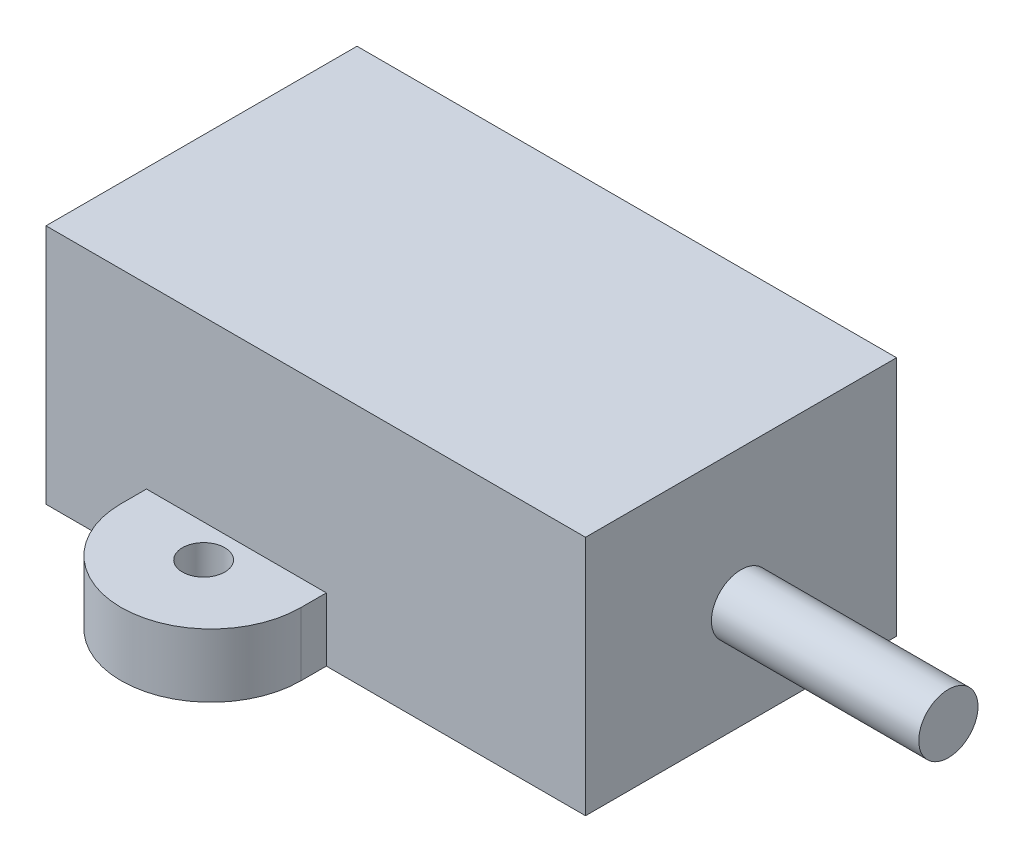
ISO-10303-21;
HEADER;
FILE_DESCRIPTION(('STEP AP214'),'2;1');
FILE_NAME('part.step','',(''),(''),'','','');
FILE_SCHEMA(('AUTOMOTIVE_DESIGN { 1 0 10303 214 1 1 1 1 }'));
ENDSEC;
DATA;
#1=APPLICATION_CONTEXT('core data for automotive mechanical design processes');
#2=APPLICATION_PROTOCOL_DEFINITION('international standard','automotive_design',2000,#1);
#3=PRODUCT_CONTEXT('',#1,'mechanical');
#4=PRODUCT('Part','Part','',(#3));
#5=PRODUCT_RELATED_PRODUCT_CATEGORY('part','',(#4));
#6=PRODUCT_DEFINITION_FORMATION('','',#4);
#7=PRODUCT_DEFINITION_CONTEXT('part definition',#1,'design');
#8=PRODUCT_DEFINITION('design','',#6,#7);
#9=PRODUCT_DEFINITION_SHAPE('','',#8);
#10=(LENGTH_UNIT() NAMED_UNIT(*) SI_UNIT(.MILLI.,.METRE.));
#11=(NAMED_UNIT(*) PLANE_ANGLE_UNIT() SI_UNIT($,.RADIAN.));
#12=(NAMED_UNIT(*) SI_UNIT($,.STERADIAN.) SOLID_ANGLE_UNIT());
#13=UNCERTAINTY_MEASURE_WITH_UNIT(LENGTH_MEASURE(1.E-05),#10,'distance_accuracy_value','');
#14=(GEOMETRIC_REPRESENTATION_CONTEXT(3) GLOBAL_UNCERTAINTY_ASSIGNED_CONTEXT((#13)) GLOBAL_UNIT_ASSIGNED_CONTEXT((#10,
#11,#12)) REPRESENTATION_CONTEXT('',''));
#15=CARTESIAN_POINT('',(0.,0.,0.));
#16=DIRECTION('',(0.,0.,1.));
#17=DIRECTION('',(1.,0.,0.));
#18=AXIS2_PLACEMENT_3D('',#15,#16,#17);
#19=CARTESIAN_POINT('',(-3.75,0.,8.55));
#20=DIRECTION('',(0.,-1.,0.));
#21=DIRECTION('',(0.,0.,-1.));
#22=AXIS2_PLACEMENT_3D('',#19,#20,#21);
#23=CYLINDRICAL_SURFACE('',#22,4.25);
#24=DIRECTION('',(0.,-1.,0.));
#25=VECTOR('',#24,1.);
#26=CARTESIAN_POINT('',(-8.,3.,8.55));
#27=LINE('',#26,#25);
#28=CARTESIAN_POINT('',(-8.,0.,8.55));
#29=VERTEX_POINT('',#28);
#30=CARTESIAN_POINT('',(-8.,3.,8.55));
#31=VERTEX_POINT('',#30);
#32=EDGE_CURVE('E136',#29,#31,#27,.F.);
#33=ORIENTED_EDGE('',*,*,#32,.F.);
#34=CARTESIAN_POINT('',(-3.75,0.,8.55));
#35=DIRECTION('',(0.,1.,0.));
#36=DIRECTION('',(0.,0.,1.));
#37=AXIS2_PLACEMENT_3D('',#34,#35,#36);
#38=CIRCLE('',#37,4.25);
#39=CARTESIAN_POINT('',(0.500000000000002,0.,8.55));
#40=VERTEX_POINT('',#39);
#41=EDGE_CURVE('E42',#40,#29,#38,.F.);
#42=ORIENTED_EDGE('',*,*,#41,.F.);
#43=DIRECTION('',(0.,-1.,0.));
#44=VECTOR('',#43,1.);
#45=CARTESIAN_POINT('',(0.500000000000002,3.,8.55));
#46=LINE('',#45,#44);
#47=CARTESIAN_POINT('',(0.500000000000002,3.,8.55));
#48=VERTEX_POINT('',#47);
#49=EDGE_CURVE('E223',#48,#40,#46,.T.);
#50=ORIENTED_EDGE('',*,*,#49,.F.);
#51=CARTESIAN_POINT('',(-3.75,3.,8.55));
#52=DIRECTION('',(0.,1.,0.));
#53=DIRECTION('',(0.,0.,1.));
#54=AXIS2_PLACEMENT_3D('',#51,#52,#53);
#55=CIRCLE('',#54,4.25);
#56=EDGE_CURVE('E11',#31,#48,#55,.T.);
#57=ORIENTED_EDGE('',*,*,#56,.F.);
#58=EDGE_LOOP('',(#33,#42,#50,#57));
#59=FACE_BOUND('',#58,.T.);
#60=ADVANCED_FACE('F34',(#59),#23,.T.);
#61=CARTESIAN_POINT('',(-12.75,11.4,7.35));
#62=DIRECTION('',(0.,0.,-1.));
#63=DIRECTION('',(-1.,0.,0.));
#64=AXIS2_PLACEMENT_3D('',#61,#62,#63);
#65=PLANE('',#64);
#66=DIRECTION('',(0.,-1.,0.));
#67=VECTOR('',#66,1.);
#68=CARTESIAN_POINT('',(-8.,3.,7.35));
#69=LINE('',#68,#67);
#70=CARTESIAN_POINT('',(-8.,3.,7.35));
#71=VERTEX_POINT('',#70);
#72=CARTESIAN_POINT('',(-8.,0.,7.35));
#73=VERTEX_POINT('',#72);
#74=EDGE_CURVE('E134',#71,#73,#69,.T.);
#75=ORIENTED_EDGE('',*,*,#74,.F.);
#76=DIRECTION('',(-1.,0.,0.));
#77=VECTOR('',#76,1.);
#78=CARTESIAN_POINT('',(-8.,3.,7.35));
#79=LINE('',#78,#77);
#80=CARTESIAN_POINT('',(0.500000000000002,3.,7.35));
#81=VERTEX_POINT('',#80);
#82=EDGE_CURVE('E118',#81,#71,#79,.T.);
#83=ORIENTED_EDGE('',*,*,#82,.F.);
#84=DIRECTION('',(0.,-1.,0.));
#85=VECTOR('',#84,1.);
#86=CARTESIAN_POINT('',(0.500000000000002,3.,7.35));
#87=LINE('',#86,#85);
#88=CARTESIAN_POINT('',(0.500000000000002,0.,7.35));
#89=VERTEX_POINT('',#88);
#90=EDGE_CURVE('E144',#81,#89,#87,.T.);
#91=ORIENTED_EDGE('',*,*,#90,.T.);
#92=DIRECTION('',(1.,0.,0.));
#93=VECTOR('',#92,1.);
#94=CARTESIAN_POINT('',(-12.75,0.,7.35));
#95=LINE('',#94,#93);
#96=CARTESIAN_POINT('',(12.75,0.,7.35));
#97=VERTEX_POINT('',#96);
#98=EDGE_CURVE('E197',#89,#97,#95,.T.);
#99=ORIENTED_EDGE('',*,*,#98,.T.);
#100=DIRECTION('',(0.,-1.,0.));
#101=VECTOR('',#100,1.);
#102=CARTESIAN_POINT('',(12.75,11.4,7.35));
#103=LINE('',#102,#101);
#104=CARTESIAN_POINT('',(12.75,11.4,7.35));
#105=VERTEX_POINT('',#104);
#106=EDGE_CURVE('E188',#105,#97,#103,.T.);
#107=ORIENTED_EDGE('',*,*,#106,.F.);
#108=DIRECTION('',(1.,0.,0.));
#109=VECTOR('',#108,1.);
#110=CARTESIAN_POINT('',(-12.75,11.4,7.35));
#111=LINE('',#110,#109);
#112=CARTESIAN_POINT('',(-12.75,11.4,7.35));
#113=VERTEX_POINT('',#112);
#114=EDGE_CURVE('E186',#113,#105,#111,.T.);
#115=ORIENTED_EDGE('',*,*,#114,.F.);
#116=DIRECTION('',(0.,-1.,0.));
#117=VECTOR('',#116,1.);
#118=CARTESIAN_POINT('',(-12.75,11.4,7.35));
#119=LINE('',#118,#117);
#120=CARTESIAN_POINT('',(-12.75,0.,7.35));
#121=VERTEX_POINT('',#120);
#122=EDGE_CURVE('E201',#113,#121,#119,.T.);
#123=ORIENTED_EDGE('',*,*,#122,.T.);
#124=EDGE_CURVE('E143',#121,#73,#95,.T.);
#125=ORIENTED_EDGE('',*,*,#124,.T.);
#126=EDGE_LOOP('',(#75,#83,#91,#99,#107,#115,#123,#125));
#127=FACE_BOUND('',#126,.T.);
#128=ADVANCED_FACE('F140',(#127),#65,.F.);
#129=CARTESIAN_POINT('',(-3.75,3.,-8.55));
#130=DIRECTION('',(0.,-1.,0.));
#131=DIRECTION('',(0.,0.,-1.));
#132=AXIS2_PLACEMENT_3D('',#129,#130,#131);
#133=CYLINDRICAL_SURFACE('',#132,4.25);
#134=DIRECTION('',(0.,-1.,0.));
#135=VECTOR('',#134,1.);
#136=CARTESIAN_POINT('',(-8.,3.,-8.55));
#137=LINE('',#136,#135);
#138=CARTESIAN_POINT('',(-8.,3.,-8.55));
#139=VERTEX_POINT('',#138);
#140=CARTESIAN_POINT('',(-8.,0.,-8.55));
#141=VERTEX_POINT('',#140);
#142=EDGE_CURVE('E212',#139,#141,#137,.T.);
#143=ORIENTED_EDGE('',*,*,#142,.F.);
#144=CARTESIAN_POINT('',(-3.75,3.,-8.55));
#145=DIRECTION('',(0.,1.,0.));
#146=DIRECTION('',(0.,0.,1.));
#147=AXIS2_PLACEMENT_3D('',#144,#145,#146);
#148=CIRCLE('',#147,4.25);
#149=CARTESIAN_POINT('',(0.500000000000002,3.,-8.55));
#150=VERTEX_POINT('',#149);
#151=EDGE_CURVE('E218',#150,#139,#148,.T.);
#152=ORIENTED_EDGE('',*,*,#151,.F.);
#153=DIRECTION('',(0.,-1.,0.));
#154=VECTOR('',#153,1.);
#155=CARTESIAN_POINT('',(0.500000000000002,3.,-8.55));
#156=LINE('',#155,#154);
#157=CARTESIAN_POINT('',(0.500000000000002,0.,-8.55));
#158=VERTEX_POINT('',#157);
#159=EDGE_CURVE('E215',#158,#150,#156,.F.);
#160=ORIENTED_EDGE('',*,*,#159,.F.);
#161=CARTESIAN_POINT('',(-3.75,0.,-8.55));
#162=DIRECTION('',(0.,1.,0.));
#163=DIRECTION('',(0.,0.,1.));
#164=AXIS2_PLACEMENT_3D('',#161,#162,#163);
#165=CIRCLE('',#164,4.25);
#166=EDGE_CURVE('E220',#141,#158,#165,.F.);
#167=ORIENTED_EDGE('',*,*,#166,.F.);
#168=EDGE_LOOP('',(#143,#152,#160,#167));
#169=FACE_BOUND('',#168,.T.);
#170=ADVANCED_FACE('F255',(#169),#133,.T.);
#171=CARTESIAN_POINT('',(-12.75,11.4,-7.35));
#172=DIRECTION('',(0.,0.,1.));
#173=DIRECTION('',(1.,0.,0.));
#174=AXIS2_PLACEMENT_3D('',#171,#172,#173);
#175=PLANE('',#174);
#176=DIRECTION('',(0.,-1.,0.));
#177=VECTOR('',#176,1.);
#178=CARTESIAN_POINT('',(0.500000000000002,3.,-7.35));
#179=LINE('',#178,#177);
#180=CARTESIAN_POINT('',(0.500000000000002,3.,-7.35));
#181=VERTEX_POINT('',#180);
#182=CARTESIAN_POINT('',(0.500000000000002,0.,-7.35));
#183=VERTEX_POINT('',#182);
#184=EDGE_CURVE('E166',#181,#183,#179,.T.);
#185=ORIENTED_EDGE('',*,*,#184,.F.);
#186=DIRECTION('',(-1.,0.,0.));
#187=VECTOR('',#186,1.);
#188=CARTESIAN_POINT('',(-8.,3.,-7.35));
#189=LINE('',#188,#187);
#190=CARTESIAN_POINT('',(-8.,3.,-7.35));
#191=VERTEX_POINT('',#190);
#192=EDGE_CURVE('E163',#181,#191,#189,.T.);
#193=ORIENTED_EDGE('',*,*,#192,.T.);
#194=DIRECTION('',(0.,-1.,0.));
#195=VECTOR('',#194,1.);
#196=CARTESIAN_POINT('',(-8.,3.,-7.35));
#197=LINE('',#196,#195);
#198=CARTESIAN_POINT('',(-8.,0.,-7.35));
#199=VERTEX_POINT('',#198);
#200=EDGE_CURVE('E170',#191,#199,#197,.T.);
#201=ORIENTED_EDGE('',*,*,#200,.T.);
#202=DIRECTION('',(-1.,0.,0.));
#203=VECTOR('',#202,1.);
#204=CARTESIAN_POINT('',(-12.75,0.,-7.35));
#205=LINE('',#204,#203);
#206=CARTESIAN_POINT('',(-12.75,0.,-7.35));
#207=VERTEX_POINT('',#206);
#208=EDGE_CURVE('E191',#199,#207,#205,.T.);
#209=ORIENTED_EDGE('',*,*,#208,.T.);
#210=DIRECTION('',(0.,-1.,0.));
#211=VECTOR('',#210,1.);
#212=CARTESIAN_POINT('',(-12.75,11.4,-7.35));
#213=LINE('',#212,#211);
#214=CARTESIAN_POINT('',(-12.75,11.4,-7.35));
#215=VERTEX_POINT('',#214);
#216=EDGE_CURVE('E203',#215,#207,#213,.T.);
#217=ORIENTED_EDGE('',*,*,#216,.F.);
#218=DIRECTION('',(-1.,0.,0.));
#219=VECTOR('',#218,1.);
#220=CARTESIAN_POINT('',(-12.75,11.4,-7.35));
#221=LINE('',#220,#219);
#222=CARTESIAN_POINT('',(12.75,11.4,-7.35));
#223=VERTEX_POINT('',#222);
#224=EDGE_CURVE('E182',#223,#215,#221,.T.);
#225=ORIENTED_EDGE('',*,*,#224,.F.);
#226=DIRECTION('',(0.,-1.,0.));
#227=VECTOR('',#226,1.);
#228=CARTESIAN_POINT('',(12.75,11.4,-7.35));
#229=LINE('',#228,#227);
#230=CARTESIAN_POINT('',(12.75,0.,-7.35));
#231=VERTEX_POINT('',#230);
#232=EDGE_CURVE('E206',#223,#231,#229,.T.);
#233=ORIENTED_EDGE('',*,*,#232,.T.);
#234=EDGE_CURVE('E192',#231,#183,#205,.T.);
#235=ORIENTED_EDGE('',*,*,#234,.T.);
#236=EDGE_LOOP('',(#185,#193,#201,#209,#217,#225,#233,#235));
#237=FACE_BOUND('',#236,.T.);
#238=ADVANCED_FACE('F260',(#237),#175,.F.);
#239=CARTESIAN_POINT('',(12.75,11.4,-7.35));
#240=DIRECTION('',(-1.,0.,0.));
#241=DIRECTION('',(0.,0.,1.));
#242=AXIS2_PLACEMENT_3D('',#239,#240,#241);
#243=PLANE('',#242);
#244=CARTESIAN_POINT('',(12.75,5.,0.));
#245=DIRECTION('',(-1.,0.,0.));
#246=DIRECTION('',(0.,0.,1.));
#247=AXIS2_PLACEMENT_3D('',#244,#245,#246);
#248=CIRCLE('',#247,1.4);
#249=CARTESIAN_POINT('',(12.75,5.,1.4));
#250=VERTEX_POINT('',#249);
#251=EDGE_CURVE('E209',#250,#250,#248,.F.);
#252=ORIENTED_EDGE('',*,*,#251,.F.);
#253=EDGE_LOOP('',(#252));
#254=FACE_BOUND('',#253,.T.);
#255=DIRECTION('',(0.,0.,-1.));
#256=VECTOR('',#255,1.);
#257=CARTESIAN_POINT('',(12.75,0.,-7.35));
#258=LINE('',#257,#256);
#259=EDGE_CURVE('E178',#97,#231,#258,.T.);
#260=ORIENTED_EDGE('',*,*,#259,.T.);
#261=ORIENTED_EDGE('',*,*,#232,.F.);
#262=DIRECTION('',(0.,0.,-1.));
#263=VECTOR('',#262,1.);
#264=CARTESIAN_POINT('',(12.75,11.4,-7.35));
#265=LINE('',#264,#263);
#266=EDGE_CURVE('E179',#105,#223,#265,.T.);
#267=ORIENTED_EDGE('',*,*,#266,.F.);
#268=ORIENTED_EDGE('',*,*,#106,.T.);
#269=EDGE_LOOP('',(#260,#261,#267,#268));
#270=FACE_BOUND('',#269,.T.);
#271=ADVANCED_FACE('F269',(#254,#270),#243,.F.);
#272=CARTESIAN_POINT('',(-12.75,11.4,-7.35));
#273=DIRECTION('',(1.,0.,0.));
#274=DIRECTION('',(0.,0.,-1.));
#275=AXIS2_PLACEMENT_3D('',#272,#273,#274);
#276=PLANE('',#275);
#277=DIRECTION('',(0.,0.,1.));
#278=VECTOR('',#277,1.);
#279=CARTESIAN_POINT('',(-12.75,0.,-7.35));
#280=LINE('',#279,#278);
#281=EDGE_CURVE('E195',#207,#121,#280,.T.);
#282=ORIENTED_EDGE('',*,*,#281,.T.);
#283=ORIENTED_EDGE('',*,*,#122,.F.);
#284=DIRECTION('',(0.,0.,1.));
#285=VECTOR('',#284,1.);
#286=CARTESIAN_POINT('',(-12.75,11.4,-7.35));
#287=LINE('',#286,#285);
#288=EDGE_CURVE('E184',#215,#113,#287,.T.);
#289=ORIENTED_EDGE('',*,*,#288,.F.);
#290=ORIENTED_EDGE('',*,*,#216,.T.);
#291=EDGE_LOOP('',(#282,#283,#289,#290));
#292=FACE_BOUND('',#291,.T.);
#293=ADVANCED_FACE('F265',(#292),#276,.F.);
#294=CARTESIAN_POINT('',(0.,11.4,0.));
#295=DIRECTION('',(0.,1.,0.));
#296=DIRECTION('',(0.,0.,1.));
#297=AXIS2_PLACEMENT_3D('',#294,#295,#296);
#298=PLANE('',#297);
#299=ORIENTED_EDGE('',*,*,#266,.T.);
#300=ORIENTED_EDGE('',*,*,#224,.T.);
#301=ORIENTED_EDGE('',*,*,#288,.T.);
#302=ORIENTED_EDGE('',*,*,#114,.T.);
#303=EDGE_LOOP('',(#299,#300,#301,#302));
#304=FACE_BOUND('',#303,.T.);
#305=ADVANCED_FACE('F268',(#304),#298,.T.);
#306=CARTESIAN_POINT('',(0.,0.,0.));
#307=DIRECTION('',(0.,1.,0.));
#308=DIRECTION('',(0.,0.,1.));
#309=AXIS2_PLACEMENT_3D('',#306,#307,#308);
#310=PLANE('',#309);
#311=DIRECTION('',(0.,0.,-1.));
#312=VECTOR('',#311,1.);
#313=CARTESIAN_POINT('',(0.500000000000001,0.,12.8));
#314=LINE('',#313,#312);
#315=EDGE_CURVE('E137',#40,#89,#314,.T.);
#316=ORIENTED_EDGE('',*,*,#315,.F.);
#317=ORIENTED_EDGE('',*,*,#41,.T.);
#318=DIRECTION('',(0.,0.,1.));
#319=VECTOR('',#318,1.);
#320=CARTESIAN_POINT('',(-8.,0.,12.8));
#321=LINE('',#320,#319);
#322=EDGE_CURVE('E228',#73,#29,#321,.T.);
#323=ORIENTED_EDGE('',*,*,#322,.F.);
#324=ORIENTED_EDGE('',*,*,#124,.F.);
#325=ORIENTED_EDGE('',*,*,#281,.F.);
#326=ORIENTED_EDGE('',*,*,#208,.F.);
#327=DIRECTION('',(0.,0.,-1.));
#328=VECTOR('',#327,1.);
#329=CARTESIAN_POINT('',(-8.,0.,-12.8));
#330=LINE('',#329,#328);
#331=EDGE_CURVE('E154',#199,#141,#330,.T.);
#332=ORIENTED_EDGE('',*,*,#331,.T.);
#333=ORIENTED_EDGE('',*,*,#166,.T.);
#334=DIRECTION('',(0.,0.,1.));
#335=VECTOR('',#334,1.);
#336=CARTESIAN_POINT('',(0.500000000000001,0.,-12.8));
#337=LINE('',#336,#335);
#338=EDGE_CURVE('E161',#158,#183,#337,.T.);
#339=ORIENTED_EDGE('',*,*,#338,.T.);
#340=ORIENTED_EDGE('',*,*,#234,.F.);
#341=ORIENTED_EDGE('',*,*,#259,.F.);
#342=ORIENTED_EDGE('',*,*,#98,.F.);
#343=EDGE_LOOP('',(#316,#317,#323,#324,#325,#326,#332,#333,#339,#340,#341,#342));
#344=FACE_BOUND('',#343,.T.);
#345=CARTESIAN_POINT('',(-3.75,0.,-8.9));
#346=DIRECTION('',(0.,-1.,0.));
#347=DIRECTION('',(0.,0.,-1.));
#348=AXIS2_PLACEMENT_3D('',#345,#346,#347);
#349=CIRCLE('',#348,1.);
#350=CARTESIAN_POINT('',(-3.75,0.,-9.9));
#351=VERTEX_POINT('',#350);
#352=EDGE_CURVE('E146',#351,#351,#349,.T.);
#353=ORIENTED_EDGE('',*,*,#352,.F.);
#354=EDGE_LOOP('',(#353));
#355=FACE_BOUND('',#354,.T.);
#356=CARTESIAN_POINT('',(-3.75,0.,8.9));
#357=DIRECTION('',(0.,1.,0.));
#358=DIRECTION('',(0.,0.,1.));
#359=AXIS2_PLACEMENT_3D('',#356,#357,#358);
#360=CIRCLE('',#359,1.);
#361=CARTESIAN_POINT('',(-3.75,0.,9.9));
#362=VERTEX_POINT('',#361);
#363=EDGE_CURVE('E233',#362,#362,#360,.T.);
#364=ORIENTED_EDGE('',*,*,#363,.T.);
#365=EDGE_LOOP('',(#364));
#366=FACE_BOUND('',#365,.T.);
#367=ADVANCED_FACE('F226',(#344,#355,#366),#310,.F.);
#368=CARTESIAN_POINT('',(22.55,5.,0.));
#369=DIRECTION('',(-1.,0.,0.));
#370=DIRECTION('',(0.,0.,1.));
#371=AXIS2_PLACEMENT_3D('',#368,#369,#370);
#372=CYLINDRICAL_SURFACE('',#371,1.4);
#373=CARTESIAN_POINT('',(22.55,5.,0.));
#374=DIRECTION('',(1.,0.,0.));
#375=DIRECTION('',(0.,0.,-1.));
#376=AXIS2_PLACEMENT_3D('',#373,#374,#375);
#377=CIRCLE('',#376,1.4);
#378=CARTESIAN_POINT('',(22.55,5.,-1.4));
#379=VERTEX_POINT('',#378);
#380=EDGE_CURVE('E173',#379,#379,#377,.T.);
#381=ORIENTED_EDGE('',*,*,#380,.F.);
#382=EDGE_LOOP('',(#381));
#383=FACE_BOUND('',#382,.T.);
#384=ORIENTED_EDGE('',*,*,#251,.T.);
#385=EDGE_LOOP('',(#384));
#386=FACE_BOUND('',#385,.T.);
#387=ADVANCED_FACE('F324',(#383,#386),#372,.T.);
#388=CARTESIAN_POINT('',(22.55,5.,0.));
#389=DIRECTION('',(1.,0.,0.));
#390=DIRECTION('',(0.,0.,-1.));
#391=AXIS2_PLACEMENT_3D('',#388,#389,#390);
#392=PLANE('',#391);
#393=ORIENTED_EDGE('',*,*,#380,.T.);
#394=EDGE_LOOP('',(#393));
#395=FACE_BOUND('',#394,.T.);
#396=ADVANCED_FACE('F318',(#395),#392,.T.);
#397=CARTESIAN_POINT('',(-8.,3.,-12.8));
#398=DIRECTION('',(-1.,0.,0.));
#399=DIRECTION('',(0.,0.,1.));
#400=AXIS2_PLACEMENT_3D('',#397,#398,#399);
#401=PLANE('',#400);
#402=DIRECTION('',(0.,0.,-1.));
#403=VECTOR('',#402,1.);
#404=CARTESIAN_POINT('',(-8.,3.,-12.8));
#405=LINE('',#404,#403);
#406=EDGE_CURVE('E157',#191,#139,#405,.T.);
#407=ORIENTED_EDGE('',*,*,#406,.T.);
#408=ORIENTED_EDGE('',*,*,#142,.T.);
#409=ORIENTED_EDGE('',*,*,#331,.F.);
#410=ORIENTED_EDGE('',*,*,#200,.F.);
#411=EDGE_LOOP('',(#407,#408,#409,#410));
#412=FACE_BOUND('',#411,.T.);
#413=ADVANCED_FACE('F301',(#412),#401,.T.);
#414=CARTESIAN_POINT('',(0.500000000000001,3.,-12.8));
#415=DIRECTION('',(1.,0.,0.));
#416=DIRECTION('',(0.,0.,-1.));
#417=AXIS2_PLACEMENT_3D('',#414,#415,#416);
#418=PLANE('',#417);
#419=ORIENTED_EDGE('',*,*,#338,.F.);
#420=ORIENTED_EDGE('',*,*,#159,.T.);
#421=DIRECTION('',(0.,0.,1.));
#422=VECTOR('',#421,1.);
#423=CARTESIAN_POINT('',(0.500000000000001,3.,-12.8));
#424=LINE('',#423,#422);
#425=EDGE_CURVE('E160',#150,#181,#424,.T.);
#426=ORIENTED_EDGE('',*,*,#425,.T.);
#427=ORIENTED_EDGE('',*,*,#184,.T.);
#428=EDGE_LOOP('',(#419,#420,#426,#427));
#429=FACE_BOUND('',#428,.T.);
#430=ADVANCED_FACE('F308',(#429),#418,.T.);
#431=CARTESIAN_POINT('',(0.,3.,0.));
#432=DIRECTION('',(0.,1.,0.));
#433=DIRECTION('',(0.,0.,1.));
#434=AXIS2_PLACEMENT_3D('',#431,#432,#433);
#435=PLANE('',#434);
#436=CARTESIAN_POINT('',(-3.75,3.,-8.9));
#437=DIRECTION('',(0.,-1.,0.));
#438=DIRECTION('',(0.,0.,-1.));
#439=AXIS2_PLACEMENT_3D('',#436,#437,#438);
#440=CIRCLE('',#439,1.);
#441=CARTESIAN_POINT('',(-3.75,3.,-9.9));
#442=VERTEX_POINT('',#441);
#443=EDGE_CURVE('E151',#442,#442,#440,.T.);
#444=ORIENTED_EDGE('',*,*,#443,.T.);
#445=EDGE_LOOP('',(#444));
#446=FACE_BOUND('',#445,.T.);
#447=ORIENTED_EDGE('',*,*,#425,.F.);
#448=ORIENTED_EDGE('',*,*,#151,.T.);
#449=ORIENTED_EDGE('',*,*,#406,.F.);
#450=ORIENTED_EDGE('',*,*,#192,.F.);
#451=EDGE_LOOP('',(#447,#448,#449,#450));
#452=FACE_BOUND('',#451,.T.);
#453=ADVANCED_FACE('F304',(#446,#452),#435,.T.);
#454=CARTESIAN_POINT('',(-3.75,3.,-8.9));
#455=DIRECTION('',(0.,-1.,0.));
#456=DIRECTION('',(0.,0.,-1.));
#457=AXIS2_PLACEMENT_3D('',#454,#455,#456);
#458=CYLINDRICAL_SURFACE('',#457,1.);
#459=ORIENTED_EDGE('',*,*,#443,.F.);
#460=EDGE_LOOP('',(#459));
#461=FACE_BOUND('',#460,.T.);
#462=ORIENTED_EDGE('',*,*,#352,.T.);
#463=EDGE_LOOP('',(#462));
#464=FACE_BOUND('',#463,.T.);
#465=ADVANCED_FACE('F315',(#461,#464),#458,.F.);
#466=CARTESIAN_POINT('',(0.,3.,0.));
#467=DIRECTION('',(0.,1.,0.));
#468=DIRECTION('',(0.,0.,-1.));
#469=AXIS2_PLACEMENT_3D('',#466,#467,#468);
#470=PLANE('',#469);
#471=DIRECTION('',(0.,0.,1.));
#472=VECTOR('',#471,1.);
#473=CARTESIAN_POINT('',(-8.,3.,12.8));
#474=LINE('',#473,#472);
#475=EDGE_CURVE('E122',#71,#31,#474,.T.);
#476=ORIENTED_EDGE('',*,*,#475,.T.);
#477=ORIENTED_EDGE('',*,*,#56,.T.);
#478=DIRECTION('',(0.,0.,-1.));
#479=VECTOR('',#478,1.);
#480=CARTESIAN_POINT('',(0.500000000000001,3.,12.8));
#481=LINE('',#480,#479);
#482=EDGE_CURVE('E124',#48,#81,#481,.T.);
#483=ORIENTED_EDGE('',*,*,#482,.T.);
#484=ORIENTED_EDGE('',*,*,#82,.T.);
#485=EDGE_LOOP('',(#476,#477,#483,#484));
#486=FACE_BOUND('',#485,.T.);
#487=CARTESIAN_POINT('',(-3.75,3.,8.9));
#488=DIRECTION('',(0.,1.,0.));
#489=DIRECTION('',(0.,0.,1.));
#490=AXIS2_PLACEMENT_3D('',#487,#488,#489);
#491=CIRCLE('',#490,1.);
#492=CARTESIAN_POINT('',(-3.75,3.,9.9));
#493=VERTEX_POINT('',#492);
#494=EDGE_CURVE('E230',#493,#493,#491,.T.);
#495=ORIENTED_EDGE('',*,*,#494,.F.);
#496=EDGE_LOOP('',(#495));
#497=FACE_BOUND('',#496,.T.);
#498=ADVANCED_FACE('F120',(#486,#497),#470,.T.);
#499=CARTESIAN_POINT('',(-8.,3.,12.8));
#500=DIRECTION('',(1.,0.,0.));
#501=DIRECTION('',(0.,0.,-1.));
#502=AXIS2_PLACEMENT_3D('',#499,#500,#501);
#503=PLANE('',#502);
#504=ORIENTED_EDGE('',*,*,#322,.T.);
#505=ORIENTED_EDGE('',*,*,#32,.T.);
#506=ORIENTED_EDGE('',*,*,#475,.F.);
#507=ORIENTED_EDGE('',*,*,#74,.T.);
#508=EDGE_LOOP('',(#504,#505,#506,#507));
#509=FACE_BOUND('',#508,.T.);
#510=ADVANCED_FACE('F133',(#509),#503,.F.);
#511=CARTESIAN_POINT('',(0.500000000000001,3.,12.8));
#512=DIRECTION('',(-1.,0.,0.));
#513=DIRECTION('',(0.,0.,1.));
#514=AXIS2_PLACEMENT_3D('',#511,#512,#513);
#515=PLANE('',#514);
#516=ORIENTED_EDGE('',*,*,#482,.F.);
#517=ORIENTED_EDGE('',*,*,#49,.T.);
#518=ORIENTED_EDGE('',*,*,#315,.T.);
#519=ORIENTED_EDGE('',*,*,#90,.F.);
#520=EDGE_LOOP('',(#516,#517,#518,#519));
#521=FACE_BOUND('',#520,.T.);
#522=ADVANCED_FACE('F242',(#521),#515,.F.);
#523=CARTESIAN_POINT('',(-3.75,3.,8.9));
#524=DIRECTION('',(0.,-1.,0.));
#525=DIRECTION('',(0.,0.,-1.));
#526=AXIS2_PLACEMENT_3D('',#523,#524,#525);
#527=CYLINDRICAL_SURFACE('',#526,1.);
#528=ORIENTED_EDGE('',*,*,#494,.T.);
#529=EDGE_LOOP('',(#528));
#530=FACE_BOUND('',#529,.T.);
#531=ORIENTED_EDGE('',*,*,#363,.F.);
#532=EDGE_LOOP('',(#531));
#533=FACE_BOUND('',#532,.T.);
#534=ADVANCED_FACE('F240',(#530,#533),#527,.F.);
#535=CLOSED_SHELL('',(#60,#128,#170,#238,#271,#293,#305,#367,#387,#396,#413,#430,#453,#465,#498,
#510,#522,#534));
#536=MANIFOLD_SOLID_BREP('B2',#535);
#537=ADVANCED_BREP_SHAPE_REPRESENTATION('',(#18,#536),#14);
#538=SHAPE_DEFINITION_REPRESENTATION(#9,#537);
ENDSEC;
END-ISO-10303-21;
